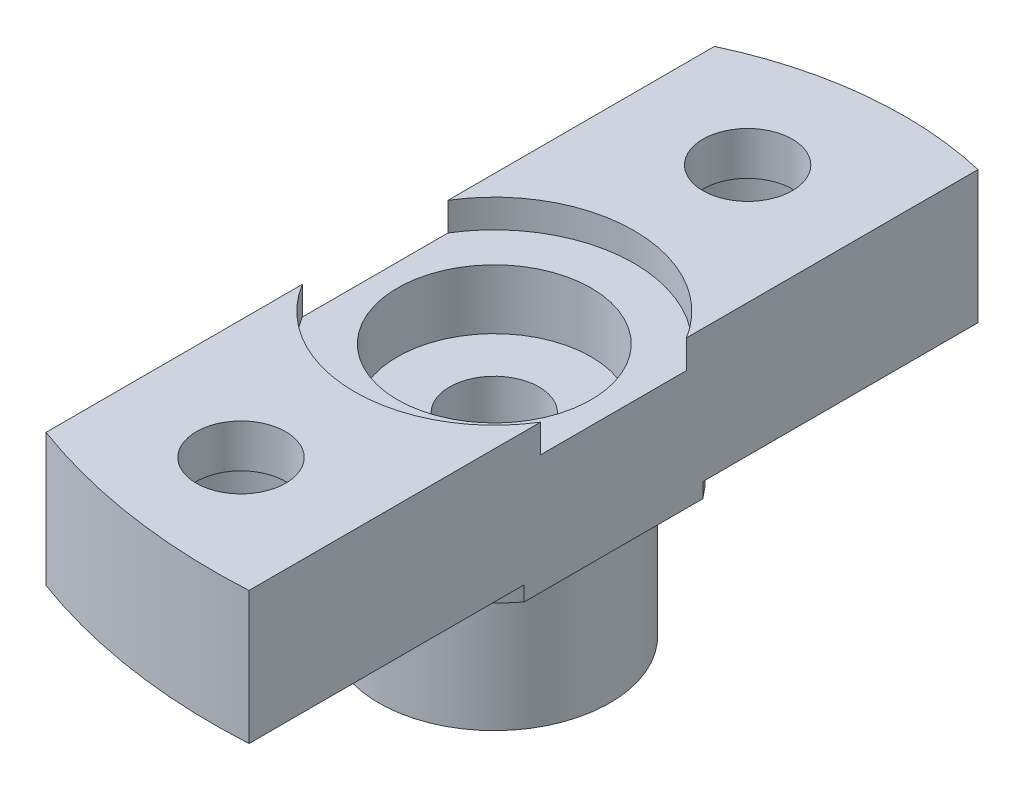
ISO-10303-21;
HEADER;
FILE_DESCRIPTION(('STEP AP214'),'2;1');
FILE_NAME('part.step','',(''),(''),'','','');
FILE_SCHEMA(('AUTOMOTIVE_DESIGN { 1 0 10303 214 1 1 1 1 }'));
ENDSEC;
DATA;
#1=APPLICATION_CONTEXT('core data for automotive mechanical design processes');
#2=APPLICATION_PROTOCOL_DEFINITION('international standard','automotive_design',2000,#1);
#3=PRODUCT_CONTEXT('',#1,'mechanical');
#4=PRODUCT('Part','Part','',(#3));
#5=PRODUCT_RELATED_PRODUCT_CATEGORY('part','',(#4));
#6=PRODUCT_DEFINITION_FORMATION('','',#4);
#7=PRODUCT_DEFINITION_CONTEXT('part definition',#1,'design');
#8=PRODUCT_DEFINITION('design','',#6,#7);
#9=PRODUCT_DEFINITION_SHAPE('','',#8);
#10=(LENGTH_UNIT() NAMED_UNIT(*) SI_UNIT(.MILLI.,.METRE.));
#11=(NAMED_UNIT(*) PLANE_ANGLE_UNIT() SI_UNIT($,.RADIAN.));
#12=(NAMED_UNIT(*) SI_UNIT($,.STERADIAN.) SOLID_ANGLE_UNIT());
#13=UNCERTAINTY_MEASURE_WITH_UNIT(LENGTH_MEASURE(1.E-05),#10,'distance_accuracy_value','');
#14=(GEOMETRIC_REPRESENTATION_CONTEXT(3) GLOBAL_UNCERTAINTY_ASSIGNED_CONTEXT((#13)) GLOBAL_UNIT_ASSIGNED_CONTEXT((#10,
#11,#12)) REPRESENTATION_CONTEXT('',''));
#15=CARTESIAN_POINT('',(0.,0.,0.));
#16=DIRECTION('',(0.,0.,1.));
#17=DIRECTION('',(1.,0.,0.));
#18=AXIS2_PLACEMENT_3D('',#15,#16,#17);
#19=CARTESIAN_POINT('',(0.,-4.66973318295596,0.));
#20=DIRECTION('',(0.,1.,0.));
#21=DIRECTION('',(0.,0.,1.));
#22=AXIS2_PLACEMENT_3D('',#19,#20,#21);
#23=CYLINDRICAL_SURFACE('',#22,1.651);
#24=CARTESIAN_POINT('',(0.,1.778,0.));
#25=DIRECTION('',(0.,1.,0.));
#26=DIRECTION('',(0.,0.,1.));
#27=AXIS2_PLACEMENT_3D('',#24,#25,#26);
#28=CIRCLE('',#27,1.651);
#29=CARTESIAN_POINT('',(0.,1.778,1.651));
#30=VERTEX_POINT('',#29);
#31=EDGE_CURVE('E215',#30,#30,#28,.T.);
#32=ORIENTED_EDGE('',*,*,#31,.T.);
#33=EDGE_LOOP('',(#32));
#34=FACE_BOUND('',#33,.T.);
#35=CARTESIAN_POINT('',(0.,0.762,0.));
#36=DIRECTION('',(0.,-1.,0.));
#37=DIRECTION('',(0.,0.,-1.));
#38=AXIS2_PLACEMENT_3D('',#35,#36,#37);
#39=CIRCLE('',#38,1.651);
#40=CARTESIAN_POINT('',(0.,0.762,-1.651));
#41=VERTEX_POINT('',#40);
#42=EDGE_CURVE('E11',#41,#41,#39,.F.);
#43=ORIENTED_EDGE('',*,*,#42,.F.);
#44=EDGE_LOOP('',(#43));
#45=FACE_BOUND('',#44,.T.);
#46=ADVANCED_FACE('F35',(#34,#45),#23,.F.);
#47=CARTESIAN_POINT('',(0.,0.,0.));
#48=DIRECTION('',(0.,1.,0.));
#49=DIRECTION('',(0.,0.,1.));
#50=AXIS2_PLACEMENT_3D('',#47,#48,#49);
#51=PLANE('',#50);
#52=DIRECTION('',(0.,0.,1.));
#53=VECTOR('',#52,1.);
#54=CARTESIAN_POINT('',(-2.032,0.,0.));
#55=LINE('',#54,#53);
#56=CARTESIAN_POINT('',(-2.032,0.,-5.78492675885656));
#57=VERTEX_POINT('',#56);
#58=CARTESIAN_POINT('',(-2.032,0.,-1.524));
#59=VERTEX_POINT('',#58);
#60=EDGE_CURVE('E249',#57,#59,#55,.T.);
#61=ORIENTED_EDGE('',*,*,#60,.F.);
#62=CARTESIAN_POINT('',(0.614973359977834,0.,-0.158832417744387));
#63=DIRECTION('',(0.,1.,0.));
#64=DIRECTION('',(0.,0.,1.));
#65=AXIS2_PLACEMENT_3D('',#62,#63,#64);
#66=CIRCLE('',#65,6.21766881584463);
#67=CARTESIAN_POINT('',(2.032,0.,-6.21287577776372));
#68=VERTEX_POINT('',#67);
#69=EDGE_CURVE('E174',#68,#57,#66,.T.);
#70=ORIENTED_EDGE('',*,*,#69,.F.);
#71=DIRECTION('',(0.,0.,1.));
#72=VECTOR('',#71,1.);
#73=CARTESIAN_POINT('',(2.032,0.,0.));
#74=LINE('',#73,#72);
#75=CARTESIAN_POINT('',(2.032,0.,-1.524));
#76=VERTEX_POINT('',#75);
#77=EDGE_CURVE('E246',#68,#76,#74,.T.);
#78=ORIENTED_EDGE('',*,*,#77,.T.);
#79=CARTESIAN_POINT('',(0.,0.,0.));
#80=DIRECTION('',(0.,-1.,0.));
#81=DIRECTION('',(0.,0.,-1.));
#82=AXIS2_PLACEMENT_3D('',#79,#80,#81);
#83=CIRCLE('',#82,2.54);
#84=EDGE_CURVE('E194',#59,#76,#83,.T.);
#85=ORIENTED_EDGE('',*,*,#84,.F.);
#86=EDGE_LOOP('',(#61,#70,#78,#85));
#87=FACE_BOUND('',#86,.T.);
#88=CARTESIAN_POINT('',(0.,0.,-4.318));
#89=DIRECTION('',(0.,1.,0.));
#90=DIRECTION('',(0.,0.,1.));
#91=AXIS2_PLACEMENT_3D('',#88,#89,#90);
#92=CIRCLE('',#91,1.27);
#93=CARTESIAN_POINT('',(0.,0.,-5.588));
#94=VERTEX_POINT('',#93);
#95=EDGE_CURVE('E225',#94,#94,#92,.T.);
#96=ORIENTED_EDGE('',*,*,#95,.T.);
#97=EDGE_LOOP('',(#96));
#98=FACE_BOUND('',#97,.T.);
#99=ADVANCED_FACE('F276',(#87,#98),#51,.F.);
#100=CARTESIAN_POINT('',(2.032,2.032,0.));
#101=DIRECTION('',(1.,0.,0.));
#102=DIRECTION('',(0.,0.,-1.));
#103=AXIS2_PLACEMENT_3D('',#100,#101,#102);
#104=PLANE('',#103);
#105=DIRECTION('',(0.,1.,0.));
#106=VECTOR('',#105,1.);
#107=CARTESIAN_POINT('',(2.032,1.778,1.24150213954709));
#108=LINE('',#107,#106);
#109=CARTESIAN_POINT('',(2.032,1.778,1.24150213954709));
#110=VERTEX_POINT('',#109);
#111=CARTESIAN_POINT('',(2.032,2.2606,1.24150213954709));
#112=VERTEX_POINT('',#111);
#113=EDGE_CURVE('E223',#110,#112,#108,.T.);
#114=ORIENTED_EDGE('',*,*,#113,.T.);
#115=DIRECTION('',(0.,0.,-1.));
#116=VECTOR('',#115,1.);
#117=CARTESIAN_POINT('',(2.032,2.2606,0.));
#118=LINE('',#117,#116);
#119=CARTESIAN_POINT('',(2.032,2.2606,6.21287577776395));
#120=VERTEX_POINT('',#119);
#121=EDGE_CURVE('E168',#120,#112,#118,.T.);
#122=ORIENTED_EDGE('',*,*,#121,.F.);
#123=DIRECTION('',(0.,-1.,0.));
#124=VECTOR('',#123,1.);
#125=CARTESIAN_POINT('',(2.032,2.032,6.21287577776395));
#126=LINE('',#125,#124);
#127=CARTESIAN_POINT('',(2.032,0.,6.21287577776395));
#128=VERTEX_POINT('',#127);
#129=EDGE_CURVE('E43',#120,#128,#126,.T.);
#130=ORIENTED_EDGE('',*,*,#129,.T.);
#131=CARTESIAN_POINT('',(2.032,0.,1.524));
#132=VERTEX_POINT('',#131);
#133=EDGE_CURVE('E235',#132,#128,#74,.T.);
#134=ORIENTED_EDGE('',*,*,#133,.F.);
#135=DIRECTION('',(0.,1.,0.));
#136=VECTOR('',#135,1.);
#137=CARTESIAN_POINT('',(2.032,-0.254,1.524));
#138=LINE('',#137,#136);
#139=CARTESIAN_POINT('',(2.032,-0.254,1.524));
#140=VERTEX_POINT('',#139);
#141=EDGE_CURVE('E212',#140,#132,#138,.T.);
#142=ORIENTED_EDGE('',*,*,#141,.F.);
#143=DIRECTION('',(0.,0.,1.));
#144=VECTOR('',#143,1.);
#145=CARTESIAN_POINT('',(2.032,-0.254,0.));
#146=LINE('',#145,#144);
#147=CARTESIAN_POINT('',(2.032,-0.254,-1.524));
#148=VERTEX_POINT('',#147);
#149=EDGE_CURVE('E193',#148,#140,#146,.T.);
#150=ORIENTED_EDGE('',*,*,#149,.F.);
#151=DIRECTION('',(0.,1.,0.));
#152=VECTOR('',#151,1.);
#153=CARTESIAN_POINT('',(2.032,-0.254,-1.524));
#154=LINE('',#153,#152);
#155=EDGE_CURVE('E203',#148,#76,#154,.T.);
#156=ORIENTED_EDGE('',*,*,#155,.T.);
#157=ORIENTED_EDGE('',*,*,#77,.F.);
#158=DIRECTION('',(0.,-1.,0.));
#159=VECTOR('',#158,1.);
#160=CARTESIAN_POINT('',(2.032,2.032,-6.21287577776372));
#161=LINE('',#160,#159);
#162=CARTESIAN_POINT('',(2.032,2.2606,-6.21287577776372));
#163=VERTEX_POINT('',#162);
#164=EDGE_CURVE('E251',#163,#68,#161,.T.);
#165=ORIENTED_EDGE('',*,*,#164,.F.);
#166=DIRECTION('',(0.,0.,-1.));
#167=VECTOR('',#166,1.);
#168=CARTESIAN_POINT('',(2.032,2.2606,0.));
#169=LINE('',#168,#167);
#170=CARTESIAN_POINT('',(2.032,2.2606,-1.24150213954709));
#171=VERTEX_POINT('',#170);
#172=EDGE_CURVE('E147',#171,#163,#169,.T.);
#173=ORIENTED_EDGE('',*,*,#172,.F.);
#174=DIRECTION('',(0.,1.,0.));
#175=VECTOR('',#174,1.);
#176=CARTESIAN_POINT('',(2.032,1.778,-1.24150213954709));
#177=LINE('',#176,#175);
#178=CARTESIAN_POINT('',(2.032,1.778,-1.24150213954709));
#179=VERTEX_POINT('',#178);
#180=EDGE_CURVE('E138',#179,#171,#177,.T.);
#181=ORIENTED_EDGE('',*,*,#180,.F.);
#182=DIRECTION('',(0.,0.,-1.));
#183=VECTOR('',#182,1.);
#184=CARTESIAN_POINT('',(2.032,1.778,0.));
#185=LINE('',#184,#183);
#186=EDGE_CURVE('E216',#110,#179,#185,.T.);
#187=ORIENTED_EDGE('',*,*,#186,.F.);
#188=EDGE_LOOP('',(#114,#122,#130,#134,#142,#150,#156,#157,#165,#173,#181,#187));
#189=FACE_BOUND('',#188,.T.);
#190=ADVANCED_FACE('F37',(#189),#104,.T.);
#191=CARTESIAN_POINT('',(0.,2.032,4.318));
#192=DIRECTION('',(0.,-1.,0.));
#193=DIRECTION('',(0.,0.,-1.));
#194=AXIS2_PLACEMENT_3D('',#191,#192,#193);
#195=CYLINDRICAL_SURFACE('',#194,0.761999999999999);
#196=CARTESIAN_POINT('',(0.,1.524,4.318));
#197=DIRECTION('',(0.,1.,0.));
#198=DIRECTION('',(0.,0.,1.));
#199=AXIS2_PLACEMENT_3D('',#196,#197,#198);
#200=CIRCLE('',#199,0.761999999999999);
#201=CARTESIAN_POINT('',(0.,1.524,5.08));
#202=VERTEX_POINT('',#201);
#203=EDGE_CURVE('E228',#202,#202,#200,.T.);
#204=ORIENTED_EDGE('',*,*,#203,.F.);
#205=EDGE_LOOP('',(#204));
#206=FACE_BOUND('',#205,.T.);
#207=CARTESIAN_POINT('',(0.,2.2606,4.318));
#208=DIRECTION('',(0.,1.,0.));
#209=DIRECTION('',(0.,0.,1.));
#210=AXIS2_PLACEMENT_3D('',#207,#208,#209);
#211=CIRCLE('',#210,0.761999999999999);
#212=CARTESIAN_POINT('',(0.,2.2606,5.08));
#213=VERTEX_POINT('',#212);
#214=EDGE_CURVE('E159',#213,#213,#211,.F.);
#215=ORIENTED_EDGE('',*,*,#214,.F.);
#216=EDGE_LOOP('',(#215));
#217=FACE_BOUND('',#216,.T.);
#218=ADVANCED_FACE('F360',(#206,#217),#195,.F.);
#219=CARTESIAN_POINT('',(-2.032,2.032,0.));
#220=DIRECTION('',(1.,0.,0.));
#221=DIRECTION('',(0.,0.,-1.));
#222=AXIS2_PLACEMENT_3D('',#219,#220,#221);
#223=PLANE('',#222);
#224=CARTESIAN_POINT('',(-2.032,0.,1.524));
#225=VERTEX_POINT('',#224);
#226=CARTESIAN_POINT('',(-2.032,0.,5.60944929125373));
#227=VERTEX_POINT('',#226);
#228=EDGE_CURVE('E248',#225,#227,#55,.T.);
#229=ORIENTED_EDGE('',*,*,#228,.T.);
#230=DIRECTION('',(0.,-1.,0.));
#231=VECTOR('',#230,1.);
#232=CARTESIAN_POINT('',(-2.032,6.87219500334325,5.60944929125373));
#233=LINE('',#232,#231);
#234=CARTESIAN_POINT('',(-2.032,2.2606,5.60944929125373));
#235=VERTEX_POINT('',#234);
#236=EDGE_CURVE('E50',#235,#227,#233,.T.);
#237=ORIENTED_EDGE('',*,*,#236,.F.);
#238=DIRECTION('',(0.,0.,1.));
#239=VECTOR('',#238,1.);
#240=CARTESIAN_POINT('',(-2.032,2.2606,0.));
#241=LINE('',#240,#239);
#242=CARTESIAN_POINT('',(-2.032,2.2606,1.24150213954709));
#243=VERTEX_POINT('',#242);
#244=EDGE_CURVE('E162',#243,#235,#241,.T.);
#245=ORIENTED_EDGE('',*,*,#244,.F.);
#246=DIRECTION('',(0.,1.,0.));
#247=VECTOR('',#246,1.);
#248=CARTESIAN_POINT('',(-2.032,1.778,1.24150213954709));
#249=LINE('',#248,#247);
#250=CARTESIAN_POINT('',(-2.032,1.778,1.24150213954709));
#251=VERTEX_POINT('',#250);
#252=EDGE_CURVE('E137',#251,#243,#249,.T.);
#253=ORIENTED_EDGE('',*,*,#252,.F.);
#254=DIRECTION('',(0.,0.,1.));
#255=VECTOR('',#254,1.);
#256=CARTESIAN_POINT('',(-2.032,1.778,0.));
#257=LINE('',#256,#255);
#258=CARTESIAN_POINT('',(-2.032,1.778,-1.24150213954709));
#259=VERTEX_POINT('',#258);
#260=EDGE_CURVE('E134',#259,#251,#257,.T.);
#261=ORIENTED_EDGE('',*,*,#260,.F.);
#262=DIRECTION('',(0.,1.,0.));
#263=VECTOR('',#262,1.);
#264=CARTESIAN_POINT('',(-2.032,1.778,-1.24150213954709));
#265=LINE('',#264,#263);
#266=CARTESIAN_POINT('',(-2.032,2.2606,-1.24150213954709));
#267=VERTEX_POINT('',#266);
#268=EDGE_CURVE('E125',#259,#267,#265,.T.);
#269=ORIENTED_EDGE('',*,*,#268,.T.);
#270=DIRECTION('',(0.,0.,-1.));
#271=VECTOR('',#270,1.);
#272=CARTESIAN_POINT('',(-2.032,2.2606,0.));
#273=LINE('',#272,#271);
#274=CARTESIAN_POINT('',(-2.032,2.2606,-5.78492675885656));
#275=VERTEX_POINT('',#274);
#276=EDGE_CURVE('E131',#267,#275,#273,.T.);
#277=ORIENTED_EDGE('',*,*,#276,.T.);
#278=DIRECTION('',(0.,-1.,0.));
#279=VECTOR('',#278,1.);
#280=CARTESIAN_POINT('',(-2.032,6.87219500334325,-5.78492675885656));
#281=LINE('',#280,#279);
#282=EDGE_CURVE('E177',#275,#57,#281,.T.);
#283=ORIENTED_EDGE('',*,*,#282,.T.);
#284=ORIENTED_EDGE('',*,*,#60,.T.);
#285=DIRECTION('',(0.,1.,0.));
#286=VECTOR('',#285,1.);
#287=CARTESIAN_POINT('',(-2.032,-0.254,-1.524));
#288=LINE('',#287,#286);
#289=CARTESIAN_POINT('',(-2.032,-0.254,-1.524));
#290=VERTEX_POINT('',#289);
#291=EDGE_CURVE('E206',#290,#59,#288,.T.);
#292=ORIENTED_EDGE('',*,*,#291,.F.);
#293=DIRECTION('',(0.,0.,-1.));
#294=VECTOR('',#293,1.);
#295=CARTESIAN_POINT('',(-2.032,-0.254,0.));
#296=LINE('',#295,#294);
#297=CARTESIAN_POINT('',(-2.032,-0.254,1.524));
#298=VERTEX_POINT('',#297);
#299=EDGE_CURVE('E199',#298,#290,#296,.T.);
#300=ORIENTED_EDGE('',*,*,#299,.F.);
#301=DIRECTION('',(0.,1.,0.));
#302=VECTOR('',#301,1.);
#303=CARTESIAN_POINT('',(-2.032,-0.254,1.524));
#304=LINE('',#303,#302);
#305=EDGE_CURVE('E209',#298,#225,#304,.T.);
#306=ORIENTED_EDGE('',*,*,#305,.T.);
#307=EDGE_LOOP('',(#229,#237,#245,#253,#261,#269,#277,#283,#284,#292,#300,#306));
#308=FACE_BOUND('',#307,.T.);
#309=ADVANCED_FACE('F128',(#308),#223,.F.);
#310=CARTESIAN_POINT('',(0.,2.032,-4.318));
#311=DIRECTION('',(0.,-1.,0.));
#312=DIRECTION('',(0.,0.,-1.));
#313=AXIS2_PLACEMENT_3D('',#310,#311,#312);
#314=CYLINDRICAL_SURFACE('',#313,0.761999999999999);
#315=CARTESIAN_POINT('',(0.,1.524,-4.318));
#316=DIRECTION('',(0.,1.,0.));
#317=DIRECTION('',(0.,0.,1.));
#318=AXIS2_PLACEMENT_3D('',#315,#316,#317);
#319=CIRCLE('',#318,0.761999999999999);
#320=CARTESIAN_POINT('',(0.,1.524,-3.556));
#321=VERTEX_POINT('',#320);
#322=EDGE_CURVE('E239',#321,#321,#319,.T.);
#323=ORIENTED_EDGE('',*,*,#322,.F.);
#324=EDGE_LOOP('',(#323));
#325=FACE_BOUND('',#324,.T.);
#326=CARTESIAN_POINT('',(4.96130914129367E-13,2.2606,-4.31800000000037));
#327=DIRECTION('',(0.,1.,0.));
#328=DIRECTION('',(0.,0.,1.));
#329=AXIS2_PLACEMENT_3D('',#326,#327,#328);
#330=CIRCLE('',#329,0.761999999999423);
#331=CARTESIAN_POINT('',(4.96130914129367E-13,2.2606,-3.55600000000095));
#332=VERTEX_POINT('',#331);
#333=EDGE_CURVE('E152',#332,#332,#330,.T.);
#334=ORIENTED_EDGE('',*,*,#333,.T.);
#335=EDGE_LOOP('',(#334));
#336=FACE_BOUND('',#335,.T.);
#337=ADVANCED_FACE('F351',(#325,#336),#314,.F.);
#338=ORIENTED_EDGE('',*,*,#133,.T.);
#339=CARTESIAN_POINT('',(1.4403671293449,0.,-3.78952536122972));
#340=DIRECTION('',(0.,1.,0.));
#341=DIRECTION('',(0.,0.,-1.));
#342=AXIS2_PLACEMENT_3D('',#339,#340,#341);
#343=CIRCLE('',#342,10.0198831330002);
#344=EDGE_CURVE('E175',#227,#128,#343,.T.);
#345=ORIENTED_EDGE('',*,*,#344,.F.);
#346=ORIENTED_EDGE('',*,*,#228,.F.);
#347=EDGE_CURVE('E58',#132,#225,#83,.T.);
#348=ORIENTED_EDGE('',*,*,#347,.F.);
#349=EDGE_LOOP('',(#338,#345,#346,#348));
#350=FACE_BOUND('',#349,.T.);
#351=CARTESIAN_POINT('',(0.,0.,4.318));
#352=DIRECTION('',(0.,1.,0.));
#353=DIRECTION('',(0.,0.,1.));
#354=AXIS2_PLACEMENT_3D('',#351,#352,#353);
#355=CIRCLE('',#354,1.27);
#356=CARTESIAN_POINT('',(0.,0.,3.048));
#357=VERTEX_POINT('',#356);
#358=EDGE_CURVE('E232',#357,#357,#355,.T.);
#359=ORIENTED_EDGE('',*,*,#358,.T.);
#360=EDGE_LOOP('',(#359));
#361=FACE_BOUND('',#360,.T.);
#362=ADVANCED_FACE('F291',(#350,#361),#51,.F.);
#363=CARTESIAN_POINT('',(0.,1.524,-4.318));
#364=DIRECTION('',(0.,-1.,0.));
#365=DIRECTION('',(0.,0.,-1.));
#366=AXIS2_PLACEMENT_3D('',#363,#364,#365);
#367=CYLINDRICAL_SURFACE('',#366,1.27);
#368=CARTESIAN_POINT('',(0.,1.524,-4.318));
#369=DIRECTION('',(0.,1.,0.));
#370=DIRECTION('',(0.,0.,1.));
#371=AXIS2_PLACEMENT_3D('',#368,#369,#370);
#372=CIRCLE('',#371,1.27);
#373=CARTESIAN_POINT('',(0.,1.524,-5.588));
#374=VERTEX_POINT('',#373);
#375=EDGE_CURVE('E238',#374,#374,#372,.T.);
#376=CARTESIAN_POINT('',(0.,1.524,-5.588));
#377=CARTESIAN_POINT('',(0.,1.508125,-5.588));
#378=CARTESIAN_POINT('',(0.,1.49225,-5.588));
#379=CARTESIAN_POINT('',(0.,1.4605,-5.588));
#380=CARTESIAN_POINT('',(0.,1.444625,-5.588));
#381=CARTESIAN_POINT('',(0.,1.412875,-5.588));
#382=CARTESIAN_POINT('',(0.,1.397,-5.588));
#383=CARTESIAN_POINT('',(0.,1.36525,-5.588));
#384=CARTESIAN_POINT('',(0.,1.349375,-5.588));
#385=CARTESIAN_POINT('',(0.,1.317625,-5.588));
#386=CARTESIAN_POINT('',(0.,1.30175,-5.588));
#387=CARTESIAN_POINT('',(0.,1.27,-5.588));
#388=CARTESIAN_POINT('',(0.,1.254125,-5.588));
#389=CARTESIAN_POINT('',(0.,1.222375,-5.588));
#390=CARTESIAN_POINT('',(0.,1.2065,-5.588));
#391=CARTESIAN_POINT('',(0.,1.17475,-5.588));
#392=CARTESIAN_POINT('',(0.,1.158875,-5.588));
#393=CARTESIAN_POINT('',(0.,1.127125,-5.588));
#394=CARTESIAN_POINT('',(0.,1.11125,-5.588));
#395=CARTESIAN_POINT('',(0.,1.0795,-5.588));
#396=CARTESIAN_POINT('',(0.,1.063625,-5.588));
#397=CARTESIAN_POINT('',(0.,1.031875,-5.588));
#398=CARTESIAN_POINT('',(0.,1.016,-5.588));
#399=CARTESIAN_POINT('',(0.,0.98425,-5.588));
#400=CARTESIAN_POINT('',(0.,0.968375,-5.588));
#401=CARTESIAN_POINT('',(0.,0.936625,-5.588));
#402=CARTESIAN_POINT('',(0.,0.92075,-5.588));
#403=CARTESIAN_POINT('',(0.,0.889,-5.588));
#404=CARTESIAN_POINT('',(0.,0.873125,-5.588));
#405=CARTESIAN_POINT('',(0.,0.841375,-5.588));
#406=CARTESIAN_POINT('',(0.,0.8255,-5.588));
#407=CARTESIAN_POINT('',(0.,0.79375,-5.588));
#408=CARTESIAN_POINT('',(0.,0.777875,-5.588));
#409=CARTESIAN_POINT('',(0.,0.746125,-5.588));
#410=CARTESIAN_POINT('',(0.,0.73025,-5.588));
#411=CARTESIAN_POINT('',(0.,0.6985,-5.588));
#412=CARTESIAN_POINT('',(0.,0.682625,-5.588));
#413=CARTESIAN_POINT('',(0.,0.650875,-5.588));
#414=CARTESIAN_POINT('',(0.,0.635,-5.588));
#415=CARTESIAN_POINT('',(0.,0.60325,-5.588));
#416=CARTESIAN_POINT('',(0.,0.587375,-5.588));
#417=CARTESIAN_POINT('',(0.,0.555625,-5.588));
#418=CARTESIAN_POINT('',(0.,0.53975,-5.588));
#419=CARTESIAN_POINT('',(0.,0.508,-5.588));
#420=CARTESIAN_POINT('',(0.,0.492125,-5.588));
#421=CARTESIAN_POINT('',(0.,0.460375,-5.588));
#422=CARTESIAN_POINT('',(0.,0.4445,-5.588));
#423=CARTESIAN_POINT('',(0.,0.41275,-5.588));
#424=CARTESIAN_POINT('',(0.,0.396875,-5.588));
#425=CARTESIAN_POINT('',(0.,0.365125,-5.588));
#426=CARTESIAN_POINT('',(0.,0.34925,-5.588));
#427=CARTESIAN_POINT('',(0.,0.3175,-5.588));
#428=CARTESIAN_POINT('',(0.,0.301625,-5.588));
#429=CARTESIAN_POINT('',(0.,0.269875,-5.588));
#430=CARTESIAN_POINT('',(0.,0.254,-5.588));
#431=CARTESIAN_POINT('',(0.,0.22225,-5.588));
#432=CARTESIAN_POINT('',(0.,0.206375,-5.588));
#433=CARTESIAN_POINT('',(0.,0.174625,-5.588));
#434=CARTESIAN_POINT('',(0.,0.15875,-5.588));
#435=CARTESIAN_POINT('',(0.,0.127,-5.588));
#436=CARTESIAN_POINT('',(0.,0.111125,-5.588));
#437=CARTESIAN_POINT('',(0.,0.079375,-5.588));
#438=CARTESIAN_POINT('',(0.,0.0635,-5.588));
#439=CARTESIAN_POINT('',(0.,0.0317499999999999,-5.588));
#440=CARTESIAN_POINT('',(0.,0.015875,-5.588));
#441=CARTESIAN_POINT('',(0.,0.,-5.588));
#442=B_SPLINE_CURVE_WITH_KNOTS('',3,(#376,#377,#378,#379,#380,#381,#382,#383,#384,#385,#386,
#387,#388,#389,#390,#391,#392,#393,#394,#395,#396,#397,#398,#399,#400,#401,#402,#403,#404,#405,
#406,#407,#408,#409,#410,#411,#412,#413,#414,#415,#416,#417,#418,#419,#420,#421,#422,#423,#424,
#425,#426,#427,#428,#429,#430,#431,#432,#433,#434,#435,#436,#437,#438,#439,#440,#441),
.UNSPECIFIED.,.F.,.F.,(4,2,2,2,2,2,2,2,2,2,2,2,2,2,2,2,2,2,2,2,2,2,2,2,2,2,2,2,2,2,2,2,4),(0.,
0.0476249999999999,0.0952499999999998,0.142875,0.1905,0.238125,0.28575,0.333375,0.381,0.428625,
0.47625,0.523875,0.5715,0.619125,0.66675,0.714375,0.762,0.809625,0.85725,0.904875,0.9525,
1.000125,1.04775,1.095375,1.143,1.190625,1.23825,1.285875,1.3335,1.381125,1.42875,1.476375,
1.524),.UNSPECIFIED.);
#443=EDGE_CURVE('BSEAM359',#374,#94,#442,.T.);
#444=ORIENTED_EDGE('',*,*,#375,.T.);
#445=ORIENTED_EDGE('',*,*,#95,.F.);
#446=ORIENTED_EDGE('',*,*,#443,.T.);
#447=ORIENTED_EDGE('',*,*,#443,.F.);
#448=EDGE_LOOP('',(#444,#446,#445,#447));
#449=FACE_BOUND('',#448,.T.);
#450=ADVANCED_FACE('F359',(#449),#367,.F.);
#451=CARTESIAN_POINT('',(0.,1.524,0.));
#452=DIRECTION('',(0.,1.,0.));
#453=DIRECTION('',(0.,0.,1.));
#454=AXIS2_PLACEMENT_3D('',#451,#452,#453);
#455=PLANE('',#454);
#456=ORIENTED_EDGE('',*,*,#322,.T.);
#457=EDGE_LOOP('',(#456));
#458=FACE_BOUND('',#457,.T.);
#459=ORIENTED_EDGE('',*,*,#375,.F.);
#460=EDGE_LOOP('',(#459));
#461=FACE_BOUND('',#460,.T.);
#462=ADVANCED_FACE('F377',(#458,#461),#455,.F.);
#463=CARTESIAN_POINT('',(0.,1.524,4.318));
#464=DIRECTION('',(0.,-1.,0.));
#465=DIRECTION('',(0.,0.,-1.));
#466=AXIS2_PLACEMENT_3D('',#463,#464,#465);
#467=CYLINDRICAL_SURFACE('',#466,1.27);
#468=CARTESIAN_POINT('',(0.,1.524,4.318));
#469=DIRECTION('',(0.,1.,0.));
#470=DIRECTION('',(0.,0.,1.));
#471=AXIS2_PLACEMENT_3D('',#468,#469,#470);
#472=CIRCLE('',#471,1.27);
#473=CARTESIAN_POINT('',(0.,1.524,3.048));
#474=VERTEX_POINT('',#473);
#475=EDGE_CURVE('E231',#474,#474,#472,.T.);
#476=CARTESIAN_POINT('',(0.,1.524,3.048));
#477=CARTESIAN_POINT('',(0.,1.508125,3.048));
#478=CARTESIAN_POINT('',(0.,1.49225,3.048));
#479=CARTESIAN_POINT('',(0.,1.4605,3.048));
#480=CARTESIAN_POINT('',(0.,1.444625,3.048));
#481=CARTESIAN_POINT('',(0.,1.412875,3.048));
#482=CARTESIAN_POINT('',(0.,1.397,3.048));
#483=CARTESIAN_POINT('',(0.,1.36525,3.048));
#484=CARTESIAN_POINT('',(0.,1.349375,3.048));
#485=CARTESIAN_POINT('',(0.,1.317625,3.048));
#486=CARTESIAN_POINT('',(0.,1.30175,3.048));
#487=CARTESIAN_POINT('',(0.,1.27,3.048));
#488=CARTESIAN_POINT('',(0.,1.254125,3.048));
#489=CARTESIAN_POINT('',(0.,1.222375,3.048));
#490=CARTESIAN_POINT('',(0.,1.2065,3.048));
#491=CARTESIAN_POINT('',(0.,1.17475,3.048));
#492=CARTESIAN_POINT('',(0.,1.158875,3.048));
#493=CARTESIAN_POINT('',(0.,1.127125,3.048));
#494=CARTESIAN_POINT('',(0.,1.11125,3.048));
#495=CARTESIAN_POINT('',(0.,1.0795,3.048));
#496=CARTESIAN_POINT('',(0.,1.063625,3.048));
#497=CARTESIAN_POINT('',(0.,1.031875,3.048));
#498=CARTESIAN_POINT('',(0.,1.016,3.048));
#499=CARTESIAN_POINT('',(0.,0.98425,3.048));
#500=CARTESIAN_POINT('',(0.,0.968375,3.048));
#501=CARTESIAN_POINT('',(0.,0.936625,3.048));
#502=CARTESIAN_POINT('',(0.,0.92075,3.048));
#503=CARTESIAN_POINT('',(0.,0.889,3.048));
#504=CARTESIAN_POINT('',(0.,0.873125,3.048));
#505=CARTESIAN_POINT('',(0.,0.841375,3.048));
#506=CARTESIAN_POINT('',(0.,0.8255,3.048));
#507=CARTESIAN_POINT('',(0.,0.79375,3.048));
#508=CARTESIAN_POINT('',(0.,0.777875,3.048));
#509=CARTESIAN_POINT('',(0.,0.746125,3.048));
#510=CARTESIAN_POINT('',(0.,0.73025,3.048));
#511=CARTESIAN_POINT('',(0.,0.6985,3.048));
#512=CARTESIAN_POINT('',(0.,0.682625,3.048));
#513=CARTESIAN_POINT('',(0.,0.650875,3.048));
#514=CARTESIAN_POINT('',(0.,0.635,3.048));
#515=CARTESIAN_POINT('',(0.,0.60325,3.048));
#516=CARTESIAN_POINT('',(0.,0.587375,3.048));
#517=CARTESIAN_POINT('',(0.,0.555625,3.048));
#518=CARTESIAN_POINT('',(0.,0.53975,3.048));
#519=CARTESIAN_POINT('',(0.,0.508,3.048));
#520=CARTESIAN_POINT('',(0.,0.492125,3.048));
#521=CARTESIAN_POINT('',(0.,0.460375,3.048));
#522=CARTESIAN_POINT('',(0.,0.4445,3.048));
#523=CARTESIAN_POINT('',(0.,0.41275,3.048));
#524=CARTESIAN_POINT('',(0.,0.396875,3.048));
#525=CARTESIAN_POINT('',(0.,0.365125,3.048));
#526=CARTESIAN_POINT('',(0.,0.34925,3.048));
#527=CARTESIAN_POINT('',(0.,0.3175,3.048));
#528=CARTESIAN_POINT('',(0.,0.301625,3.048));
#529=CARTESIAN_POINT('',(0.,0.269875,3.048));
#530=CARTESIAN_POINT('',(0.,0.254,3.048));
#531=CARTESIAN_POINT('',(0.,0.22225,3.048));
#532=CARTESIAN_POINT('',(0.,0.206375,3.048));
#533=CARTESIAN_POINT('',(0.,0.174625,3.048));
#534=CARTESIAN_POINT('',(0.,0.15875,3.048));
#535=CARTESIAN_POINT('',(0.,0.127,3.048));
#536=CARTESIAN_POINT('',(0.,0.111125,3.048));
#537=CARTESIAN_POINT('',(0.,0.079375,3.048));
#538=CARTESIAN_POINT('',(0.,0.0635,3.048));
#539=CARTESIAN_POINT('',(0.,0.0317499999999999,3.048));
#540=CARTESIAN_POINT('',(0.,0.015875,3.048));
#541=CARTESIAN_POINT('',(0.,0.,3.048));
#542=B_SPLINE_CURVE_WITH_KNOTS('',3,(#476,#477,#478,#479,#480,#481,#482,#483,#484,#485,#486,
#487,#488,#489,#490,#491,#492,#493,#494,#495,#496,#497,#498,#499,#500,#501,#502,#503,#504,#505,
#506,#507,#508,#509,#510,#511,#512,#513,#514,#515,#516,#517,#518,#519,#520,#521,#522,#523,#524,
#525,#526,#527,#528,#529,#530,#531,#532,#533,#534,#535,#536,#537,#538,#539,#540,#541),
.UNSPECIFIED.,.F.,.F.,(4,2,2,2,2,2,2,2,2,2,2,2,2,2,2,2,2,2,2,2,2,2,2,2,2,2,2,2,2,2,2,2,4),(0.,
0.0476249999999999,0.0952499999999998,0.142875,0.1905,0.238125,0.28575,0.333375,0.381,0.428625,
0.47625,0.523875,0.5715,0.619125,0.66675,0.714375,0.762,0.809625,0.85725,0.904875,0.9525,
1.000125,1.04775,1.095375,1.143,1.190625,1.23825,1.285875,1.3335,1.381125,1.42875,1.476375,
1.524),.UNSPECIFIED.);
#543=EDGE_CURVE('BSEAM307',#474,#357,#542,.T.);
#544=ORIENTED_EDGE('',*,*,#475,.T.);
#545=ORIENTED_EDGE('',*,*,#358,.F.);
#546=ORIENTED_EDGE('',*,*,#543,.T.);
#547=ORIENTED_EDGE('',*,*,#543,.F.);
#548=EDGE_LOOP('',(#544,#546,#545,#547));
#549=FACE_BOUND('',#548,.T.);
#550=ADVANCED_FACE('F307',(#549),#467,.F.);
#551=CARTESIAN_POINT('',(0.,1.524,0.));
#552=DIRECTION('',(0.,1.,0.));
#553=DIRECTION('',(0.,0.,1.));
#554=AXIS2_PLACEMENT_3D('',#551,#552,#553);
#555=PLANE('',#554);
#556=ORIENTED_EDGE('',*,*,#203,.T.);
#557=EDGE_LOOP('',(#556));
#558=FACE_BOUND('',#557,.T.);
#559=ORIENTED_EDGE('',*,*,#475,.F.);
#560=EDGE_LOOP('',(#559));
#561=FACE_BOUND('',#560,.T.);
#562=ADVANCED_FACE('F301',(#558,#561),#555,.F.);
#563=CARTESIAN_POINT('',(0.,1.778,0.));
#564=DIRECTION('',(0.,1.,0.));
#565=DIRECTION('',(0.,0.,1.));
#566=AXIS2_PLACEMENT_3D('',#563,#564,#565);
#567=CYLINDRICAL_SURFACE('',#566,2.38125);
#568=ORIENTED_EDGE('',*,*,#252,.T.);
#569=CARTESIAN_POINT('',(0.,2.2606,0.));
#570=DIRECTION('',(0.,1.,0.));
#571=DIRECTION('',(0.,0.,1.));
#572=AXIS2_PLACEMENT_3D('',#569,#570,#571);
#573=CIRCLE('',#572,2.38125);
#574=EDGE_CURVE('E171',#112,#243,#573,.F.);
#575=ORIENTED_EDGE('',*,*,#574,.F.);
#576=ORIENTED_EDGE('',*,*,#113,.F.);
#577=CARTESIAN_POINT('',(0.,1.778,0.));
#578=DIRECTION('',(0.,1.,0.));
#579=DIRECTION('',(0.,0.,1.));
#580=AXIS2_PLACEMENT_3D('',#577,#578,#579);
#581=CIRCLE('',#580,2.38125);
#582=EDGE_CURVE('E221',#251,#110,#581,.T.);
#583=ORIENTED_EDGE('',*,*,#582,.F.);
#584=EDGE_LOOP('',(#568,#575,#576,#583));
#585=FACE_BOUND('',#584,.T.);
#586=ADVANCED_FACE('F299',(#585),#567,.F.);
#587=ORIENTED_EDGE('',*,*,#180,.T.);
#588=CARTESIAN_POINT('',(0.,2.2606,0.));
#589=DIRECTION('',(0.,1.,0.));
#590=DIRECTION('',(0.,0.,1.));
#591=AXIS2_PLACEMENT_3D('',#588,#589,#590);
#592=CIRCLE('',#591,2.38125000000001);
#593=EDGE_CURVE('E141',#267,#171,#592,.F.);
#594=ORIENTED_EDGE('',*,*,#593,.F.);
#595=ORIENTED_EDGE('',*,*,#268,.F.);
#596=EDGE_CURVE('E219',#179,#259,#581,.T.);
#597=ORIENTED_EDGE('',*,*,#596,.F.);
#598=EDGE_LOOP('',(#587,#594,#595,#597));
#599=FACE_BOUND('',#598,.T.);
#600=ADVANCED_FACE('F142',(#599),#567,.F.);
#601=CARTESIAN_POINT('',(0.,1.778,0.));
#602=DIRECTION('',(0.,1.,0.));
#603=DIRECTION('',(0.,0.,1.));
#604=AXIS2_PLACEMENT_3D('',#601,#602,#603);
#605=PLANE('',#604);
#606=ORIENTED_EDGE('',*,*,#31,.F.);
#607=EDGE_LOOP('',(#606));
#608=FACE_BOUND('',#607,.T.);
#609=ORIENTED_EDGE('',*,*,#186,.T.);
#610=ORIENTED_EDGE('',*,*,#596,.T.);
#611=ORIENTED_EDGE('',*,*,#260,.T.);
#612=ORIENTED_EDGE('',*,*,#582,.T.);
#613=EDGE_LOOP('',(#609,#610,#611,#612));
#614=FACE_BOUND('',#613,.T.);
#615=ADVANCED_FACE('F259',(#608,#614),#605,.T.);
#616=CARTESIAN_POINT('',(0.,-0.254,0.));
#617=DIRECTION('',(0.,1.,0.));
#618=DIRECTION('',(0.,0.,1.));
#619=AXIS2_PLACEMENT_3D('',#616,#617,#618);
#620=CYLINDRICAL_SURFACE('',#619,2.54);
#621=ORIENTED_EDGE('',*,*,#347,.T.);
#622=ORIENTED_EDGE('',*,*,#305,.F.);
#623=CARTESIAN_POINT('',(0.,-0.254,0.));
#624=DIRECTION('',(0.,-1.,0.));
#625=DIRECTION('',(0.,0.,-1.));
#626=AXIS2_PLACEMENT_3D('',#623,#624,#625);
#627=CIRCLE('',#626,2.54);
#628=EDGE_CURVE('E197',#140,#298,#627,.T.);
#629=ORIENTED_EDGE('',*,*,#628,.F.);
#630=ORIENTED_EDGE('',*,*,#141,.T.);
#631=EDGE_LOOP('',(#621,#622,#629,#630));
#632=FACE_BOUND('',#631,.T.);
#633=ADVANCED_FACE('F262',(#632),#620,.T.);
#634=ORIENTED_EDGE('',*,*,#84,.T.);
#635=ORIENTED_EDGE('',*,*,#155,.F.);
#636=EDGE_CURVE('E200',#290,#148,#627,.T.);
#637=ORIENTED_EDGE('',*,*,#636,.F.);
#638=ORIENTED_EDGE('',*,*,#291,.T.);
#639=EDGE_LOOP('',(#634,#635,#637,#638));
#640=FACE_BOUND('',#639,.T.);
#641=ADVANCED_FACE('F282',(#640),#620,.T.);
#642=CARTESIAN_POINT('',(0.,-0.254,0.));
#643=DIRECTION('',(0.,-1.,0.));
#644=DIRECTION('',(0.,0.,-1.));
#645=AXIS2_PLACEMENT_3D('',#642,#643,#644);
#646=PLANE('',#645);
#647=CARTESIAN_POINT('',(0.,-0.254,0.));
#648=DIRECTION('',(0.,-1.,0.));
#649=DIRECTION('',(0.,0.,-1.));
#650=AXIS2_PLACEMENT_3D('',#647,#648,#649);
#651=CIRCLE('',#650,1.9685);
#652=CARTESIAN_POINT('',(0.,-0.254,-1.9685));
#653=VERTEX_POINT('',#652);
#654=EDGE_CURVE('E190',#653,#653,#651,.T.);
#655=ORIENTED_EDGE('',*,*,#654,.F.);
#656=EDGE_LOOP('',(#655));
#657=FACE_BOUND('',#656,.T.);
#658=ORIENTED_EDGE('',*,*,#149,.T.);
#659=ORIENTED_EDGE('',*,*,#628,.T.);
#660=ORIENTED_EDGE('',*,*,#299,.T.);
#661=ORIENTED_EDGE('',*,*,#636,.T.);
#662=EDGE_LOOP('',(#658,#659,#660,#661));
#663=FACE_BOUND('',#662,.T.);
#664=ADVANCED_FACE('F286',(#657,#663),#646,.T.);
#665=CARTESIAN_POINT('',(0.,0.762,0.));
#666=DIRECTION('',(0.,-1.,0.));
#667=DIRECTION('',(0.,0.,-1.));
#668=AXIS2_PLACEMENT_3D('',#665,#666,#667);
#669=PLANE('',#668);
#670=CARTESIAN_POINT('',(0.,0.762,0.));
#671=DIRECTION('',(0.,-1.,0.));
#672=DIRECTION('',(0.,0.,-1.));
#673=AXIS2_PLACEMENT_3D('',#670,#671,#672);
#674=CIRCLE('',#673,0.762);
#675=CARTESIAN_POINT('',(0.,0.762,-0.762));
#676=VERTEX_POINT('',#675);
#677=EDGE_CURVE('E187',#676,#676,#674,.T.);
#678=ORIENTED_EDGE('',*,*,#677,.T.);
#679=EDGE_LOOP('',(#678));
#680=FACE_BOUND('',#679,.T.);
#681=ORIENTED_EDGE('',*,*,#42,.T.);
#682=EDGE_LOOP('',(#681));
#683=FACE_BOUND('',#682,.T.);
#684=ADVANCED_FACE('F321',(#680,#683),#669,.F.);
#685=CARTESIAN_POINT('',(0.,0.762,0.));
#686=DIRECTION('',(0.,-1.,0.));
#687=DIRECTION('',(0.,0.,-1.));
#688=AXIS2_PLACEMENT_3D('',#685,#686,#687);
#689=CYLINDRICAL_SURFACE('',#688,1.9685);
#690=CARTESIAN_POINT('',(0.,-2.54,0.));
#691=DIRECTION('',(0.,-1.,0.));
#692=DIRECTION('',(0.,0.,-1.));
#693=AXIS2_PLACEMENT_3D('',#690,#691,#692);
#694=CIRCLE('',#693,1.9685);
#695=CARTESIAN_POINT('',(0.,-2.54,-1.9685));
#696=VERTEX_POINT('',#695);
#697=EDGE_CURVE('E179',#696,#696,#694,.T.);
#698=CARTESIAN_POINT('',(0.,-0.254,-1.9685));
#699=CARTESIAN_POINT('',(0.,-0.2778125,-1.9685));
#700=CARTESIAN_POINT('',(0.,-0.301625,-1.9685));
#701=CARTESIAN_POINT('',(0.,-0.34925,-1.9685));
#702=CARTESIAN_POINT('',(0.,-0.3730625,-1.9685));
#703=CARTESIAN_POINT('',(0.,-0.4206875,-1.9685));
#704=CARTESIAN_POINT('',(0.,-0.4445,-1.9685));
#705=CARTESIAN_POINT('',(0.,-0.492125,-1.9685));
#706=CARTESIAN_POINT('',(0.,-0.5159375,-1.9685));
#707=CARTESIAN_POINT('',(0.,-0.5635625,-1.9685));
#708=CARTESIAN_POINT('',(0.,-0.587375,-1.9685));
#709=CARTESIAN_POINT('',(0.,-0.635,-1.9685));
#710=CARTESIAN_POINT('',(0.,-0.6588125,-1.9685));
#711=CARTESIAN_POINT('',(0.,-0.7064375,-1.9685));
#712=CARTESIAN_POINT('',(0.,-0.73025,-1.9685));
#713=CARTESIAN_POINT('',(0.,-0.777875,-1.9685));
#714=CARTESIAN_POINT('',(0.,-0.8016875,-1.9685));
#715=CARTESIAN_POINT('',(0.,-0.8493125,-1.9685));
#716=CARTESIAN_POINT('',(0.,-0.873125,-1.9685));
#717=CARTESIAN_POINT('',(0.,-0.92075,-1.9685));
#718=CARTESIAN_POINT('',(0.,-0.9445625,-1.9685));
#719=CARTESIAN_POINT('',(0.,-0.9921875,-1.9685));
#720=CARTESIAN_POINT('',(0.,-1.016,-1.9685));
#721=CARTESIAN_POINT('',(0.,-1.063625,-1.9685));
#722=CARTESIAN_POINT('',(0.,-1.0874375,-1.9685));
#723=CARTESIAN_POINT('',(0.,-1.1350625,-1.9685));
#724=CARTESIAN_POINT('',(0.,-1.158875,-1.9685));
#725=CARTESIAN_POINT('',(0.,-1.2065,-1.9685));
#726=CARTESIAN_POINT('',(0.,-1.2303125,-1.9685));
#727=CARTESIAN_POINT('',(0.,-1.2779375,-1.9685));
#728=CARTESIAN_POINT('',(0.,-1.30175,-1.9685));
#729=CARTESIAN_POINT('',(0.,-1.349375,-1.9685));
#730=CARTESIAN_POINT('',(0.,-1.3731875,-1.9685));
#731=CARTESIAN_POINT('',(0.,-1.4208125,-1.9685));
#732=CARTESIAN_POINT('',(0.,-1.444625,-1.9685));
#733=CARTESIAN_POINT('',(0.,-1.49225,-1.9685));
#734=CARTESIAN_POINT('',(0.,-1.5160625,-1.9685));
#735=CARTESIAN_POINT('',(0.,-1.5636875,-1.9685));
#736=CARTESIAN_POINT('',(0.,-1.5875,-1.9685));
#737=CARTESIAN_POINT('',(0.,-1.635125,-1.9685));
#738=CARTESIAN_POINT('',(0.,-1.6589375,-1.9685));
#739=CARTESIAN_POINT('',(0.,-1.7065625,-1.9685));
#740=CARTESIAN_POINT('',(0.,-1.730375,-1.9685));
#741=CARTESIAN_POINT('',(0.,-1.778,-1.9685));
#742=CARTESIAN_POINT('',(0.,-1.8018125,-1.9685));
#743=CARTESIAN_POINT('',(0.,-1.8494375,-1.9685));
#744=CARTESIAN_POINT('',(0.,-1.87325,-1.9685));
#745=CARTESIAN_POINT('',(0.,-1.920875,-1.9685));
#746=CARTESIAN_POINT('',(0.,-1.9446875,-1.9685));
#747=CARTESIAN_POINT('',(0.,-1.9923125,-1.9685));
#748=CARTESIAN_POINT('',(0.,-2.016125,-1.9685));
#749=CARTESIAN_POINT('',(0.,-2.06375,-1.9685));
#750=CARTESIAN_POINT('',(0.,-2.0875625,-1.9685));
#751=CARTESIAN_POINT('',(0.,-2.1351875,-1.9685));
#752=CARTESIAN_POINT('',(0.,-2.159,-1.9685));
#753=CARTESIAN_POINT('',(0.,-2.206625,-1.9685));
#754=CARTESIAN_POINT('',(0.,-2.2304375,-1.9685));
#755=CARTESIAN_POINT('',(0.,-2.2780625,-1.9685));
#756=CARTESIAN_POINT('',(0.,-2.301875,-1.9685));
#757=CARTESIAN_POINT('',(0.,-2.3495,-1.9685));
#758=CARTESIAN_POINT('',(0.,-2.3733125,-1.9685));
#759=CARTESIAN_POINT('',(0.,-2.4209375,-1.9685));
#760=CARTESIAN_POINT('',(0.,-2.44475,-1.9685));
#761=CARTESIAN_POINT('',(0.,-2.492375,-1.9685));
#762=CARTESIAN_POINT('',(0.,-2.5161875,-1.9685));
#763=CARTESIAN_POINT('',(0.,-2.54,-1.9685));
#764=B_SPLINE_CURVE_WITH_KNOTS('',3,(#698,#699,#700,#701,#702,#703,#704,#705,#706,#707,#708,
#709,#710,#711,#712,#713,#714,#715,#716,#717,#718,#719,#720,#721,#722,#723,#724,#725,#726,#727,
#728,#729,#730,#731,#732,#733,#734,#735,#736,#737,#738,#739,#740,#741,#742,#743,#744,#745,#746,
#747,#748,#749,#750,#751,#752,#753,#754,#755,#756,#757,#758,#759,#760,#761,#762,#763),
.UNSPECIFIED.,.F.,.F.,(4,2,2,2,2,2,2,2,2,2,2,2,2,2,2,2,2,2,2,2,2,2,2,2,2,2,2,2,2,2,2,2,4),(0.,
0.0714375000000001,0.142875,0.2143125,0.28575,0.3571875,0.428625,0.5000625,0.5715,0.6429375,
0.714375,0.7858125,0.85725,0.9286875,1.000125,1.0715625,1.143,1.2144375,1.285875,1.3573125,
1.42875,1.5001875,1.571625,1.6430625,1.7145,1.7859375,1.857375,1.9288125,2.00025,2.0716875,
2.143125,2.2145625,2.286),.UNSPECIFIED.);
#765=EDGE_CURVE('BSEAM323',#653,#696,#764,.T.);
#766=ORIENTED_EDGE('',*,*,#654,.T.);
#767=ORIENTED_EDGE('',*,*,#697,.F.);
#768=ORIENTED_EDGE('',*,*,#765,.T.);
#769=ORIENTED_EDGE('',*,*,#765,.F.);
#770=EDGE_LOOP('',(#766,#768,#767,#769));
#771=FACE_BOUND('',#770,.T.);
#772=ADVANCED_FACE('F323',(#771),#689,.T.);
#773=CARTESIAN_POINT('',(0.,0.762,0.));
#774=DIRECTION('',(0.,-1.,0.));
#775=DIRECTION('',(0.,0.,-1.));
#776=AXIS2_PLACEMENT_3D('',#773,#774,#775);
#777=CYLINDRICAL_SURFACE('',#776,0.762);
#778=CARTESIAN_POINT('',(0.,-2.54,0.));
#779=DIRECTION('',(0.,-1.,0.));
#780=DIRECTION('',(0.,0.,-1.));
#781=AXIS2_PLACEMENT_3D('',#778,#779,#780);
#782=CIRCLE('',#781,0.762);
#783=CARTESIAN_POINT('',(0.,-2.54,-0.762));
#784=VERTEX_POINT('',#783);
#785=EDGE_CURVE('E184',#784,#784,#782,.T.);
#786=CARTESIAN_POINT('',(0.,0.762,-0.762));
#787=CARTESIAN_POINT('',(0.,0.727604166666667,-0.762));
#788=CARTESIAN_POINT('',(0.,0.693208333333333,-0.762));
#789=CARTESIAN_POINT('',(0.,0.624416666666667,-0.762));
#790=CARTESIAN_POINT('',(0.,0.590020833333333,-0.762));
#791=CARTESIAN_POINT('',(0.,0.521229166666667,-0.762));
#792=CARTESIAN_POINT('',(0.,0.486833333333333,-0.762));
#793=CARTESIAN_POINT('',(0.,0.418041666666667,-0.762));
#794=CARTESIAN_POINT('',(0.,0.383645833333333,-0.762));
#795=CARTESIAN_POINT('',(0.,0.314854166666667,-0.762));
#796=CARTESIAN_POINT('',(0.,0.280458333333333,-0.762));
#797=CARTESIAN_POINT('',(0.,0.211666666666667,-0.762));
#798=CARTESIAN_POINT('',(0.,0.177270833333333,-0.762));
#799=CARTESIAN_POINT('',(0.,0.108479166666667,-0.762));
#800=CARTESIAN_POINT('',(0.,0.0740833333333334,-0.762));
#801=CARTESIAN_POINT('',(0.,0.0052916666666668,-0.762));
#802=CARTESIAN_POINT('',(0.,-0.0291041666666665,-0.762));
#803=CARTESIAN_POINT('',(0.,-0.0978958333333332,-0.762));
#804=CARTESIAN_POINT('',(0.,-0.132291666666667,-0.762));
#805=CARTESIAN_POINT('',(0.,-0.201083333333333,-0.762));
#806=CARTESIAN_POINT('',(0.,-0.235479166666666,-0.762));
#807=CARTESIAN_POINT('',(0.,-0.304270833333333,-0.762));
#808=CARTESIAN_POINT('',(0.,-0.338666666666667,-0.762));
#809=CARTESIAN_POINT('',(0.,-0.407458333333333,-0.762));
#810=CARTESIAN_POINT('',(0.,-0.441854166666667,-0.762));
#811=CARTESIAN_POINT('',(0.,-0.510645833333333,-0.762));
#812=CARTESIAN_POINT('',(0.,-0.545041666666667,-0.762));
#813=CARTESIAN_POINT('',(0.,-0.613833333333333,-0.762));
#814=CARTESIAN_POINT('',(0.,-0.648229166666667,-0.762));
#815=CARTESIAN_POINT('',(0.,-0.717020833333333,-0.762));
#816=CARTESIAN_POINT('',(0.,-0.751416666666667,-0.762));
#817=CARTESIAN_POINT('',(0.,-0.820208333333333,-0.762));
#818=CARTESIAN_POINT('',(0.,-0.854604166666667,-0.762));
#819=CARTESIAN_POINT('',(0.,-0.923395833333333,-0.762));
#820=CARTESIAN_POINT('',(0.,-0.957791666666667,-0.762));
#821=CARTESIAN_POINT('',(0.,-1.02658333333333,-0.762));
#822=CARTESIAN_POINT('',(0.,-1.06097916666667,-0.762));
#823=CARTESIAN_POINT('',(0.,-1.12977083333333,-0.762));
#824=CARTESIAN_POINT('',(0.,-1.16416666666667,-0.762));
#825=CARTESIAN_POINT('',(0.,-1.23295833333333,-0.762));
#826=CARTESIAN_POINT('',(0.,-1.26735416666667,-0.762));
#827=CARTESIAN_POINT('',(0.,-1.33614583333333,-0.762));
#828=CARTESIAN_POINT('',(0.,-1.37054166666667,-0.762));
#829=CARTESIAN_POINT('',(0.,-1.43933333333333,-0.762));
#830=CARTESIAN_POINT('',(0.,-1.47372916666667,-0.762));
#831=CARTESIAN_POINT('',(0.,-1.54252083333333,-0.762));
#832=CARTESIAN_POINT('',(0.,-1.57691666666667,-0.762));
#833=CARTESIAN_POINT('',(0.,-1.64570833333333,-0.762));
#834=CARTESIAN_POINT('',(0.,-1.68010416666667,-0.762));
#835=CARTESIAN_POINT('',(0.,-1.74889583333333,-0.762));
#836=CARTESIAN_POINT('',(0.,-1.78329166666667,-0.762));
#837=CARTESIAN_POINT('',(0.,-1.85208333333333,-0.762));
#838=CARTESIAN_POINT('',(0.,-1.88647916666667,-0.762));
#839=CARTESIAN_POINT('',(0.,-1.95527083333333,-0.762));
#840=CARTESIAN_POINT('',(0.,-1.98966666666667,-0.762));
#841=CARTESIAN_POINT('',(0.,-2.05845833333333,-0.762));
#842=CARTESIAN_POINT('',(0.,-2.09285416666667,-0.762));
#843=CARTESIAN_POINT('',(0.,-2.16164583333333,-0.762));
#844=CARTESIAN_POINT('',(0.,-2.19604166666667,-0.762));
#845=CARTESIAN_POINT('',(0.,-2.26483333333333,-0.762));
#846=CARTESIAN_POINT('',(0.,-2.29922916666667,-0.762));
#847=CARTESIAN_POINT('',(0.,-2.36802083333333,-0.762));
#848=CARTESIAN_POINT('',(0.,-2.40241666666667,-0.762));
#849=CARTESIAN_POINT('',(0.,-2.47120833333333,-0.762));
#850=CARTESIAN_POINT('',(0.,-2.50560416666667,-0.762));
#851=CARTESIAN_POINT('',(0.,-2.54,-0.762));
#852=B_SPLINE_CURVE_WITH_KNOTS('',3,(#786,#787,#788,#789,#790,#791,#792,#793,#794,#795,#796,
#797,#798,#799,#800,#801,#802,#803,#804,#805,#806,#807,#808,#809,#810,#811,#812,#813,#814,#815,
#816,#817,#818,#819,#820,#821,#822,#823,#824,#825,#826,#827,#828,#829,#830,#831,#832,#833,#834,
#835,#836,#837,#838,#839,#840,#841,#842,#843,#844,#845,#846,#847,#848,#849,#850,#851),
.UNSPECIFIED.,.F.,.F.,(4,2,2,2,2,2,2,2,2,2,2,2,2,2,2,2,2,2,2,2,2,2,2,2,2,2,2,2,2,2,2,2,4),(0.,
0.1031875,0.206375,0.3095625,0.41275,0.5159375,0.619125,0.7223125,0.8255,0.9286875,1.031875,
1.1350625,1.23825,1.3414375,1.444625,1.5478125,1.651,1.7541875,1.857375,1.9605625,2.06375,
2.1669375,2.270125,2.3733125,2.4765,2.5796875,2.682875,2.7860625,2.88925,2.9924375,3.095625,
3.1988125,3.302),.UNSPECIFIED.);
#853=EDGE_CURVE('BSEAM326',#676,#784,#852,.T.);
#854=ORIENTED_EDGE('',*,*,#677,.F.);
#855=ORIENTED_EDGE('',*,*,#785,.T.);
#856=ORIENTED_EDGE('',*,*,#853,.T.);
#857=ORIENTED_EDGE('',*,*,#853,.F.);
#858=EDGE_LOOP('',(#854,#856,#855,#857));
#859=FACE_BOUND('',#858,.T.);
#860=ADVANCED_FACE('F326',(#859),#777,.F.);
#861=CARTESIAN_POINT('',(0.,-2.54,0.));
#862=DIRECTION('',(0.,-1.,0.));
#863=DIRECTION('',(0.,0.,-1.));
#864=AXIS2_PLACEMENT_3D('',#861,#862,#863);
#865=PLANE('',#864);
#866=ORIENTED_EDGE('',*,*,#697,.T.);
#867=EDGE_LOOP('',(#866));
#868=FACE_BOUND('',#867,.T.);
#869=ORIENTED_EDGE('',*,*,#785,.F.);
#870=EDGE_LOOP('',(#869));
#871=FACE_BOUND('',#870,.T.);
#872=ADVANCED_FACE('F330',(#868,#871),#865,.T.);
#873=CARTESIAN_POINT('',(1.4403671293449,6.87219500334325,-3.78952536122972));
#874=DIRECTION('',(0.,-1.,0.));
#875=DIRECTION('',(0.,0.,-1.));
#876=AXIS2_PLACEMENT_3D('',#873,#874,#875);
#877=CYLINDRICAL_SURFACE('',#876,10.0198831330002);
#878=ORIENTED_EDGE('',*,*,#236,.T.);
#879=ORIENTED_EDGE('',*,*,#344,.T.);
#880=ORIENTED_EDGE('',*,*,#129,.F.);
#881=CARTESIAN_POINT('',(1.4403671293449,2.2606,-3.78952536122972));
#882=DIRECTION('',(0.,1.,0.));
#883=DIRECTION('',(0.,0.,1.));
#884=AXIS2_PLACEMENT_3D('',#881,#882,#883);
#885=CIRCLE('',#884,10.0198831330002);
#886=EDGE_CURVE('E165',#235,#120,#885,.T.);
#887=ORIENTED_EDGE('',*,*,#886,.F.);
#888=EDGE_LOOP('',(#878,#879,#880,#887));
#889=FACE_BOUND('',#888,.T.);
#890=ADVANCED_FACE('F294',(#889),#877,.T.);
#891=CARTESIAN_POINT('',(0.614973359977834,6.87219500334325,-0.158832417744387));
#892=DIRECTION('',(0.,-1.,0.));
#893=DIRECTION('',(0.,0.,-1.));
#894=AXIS2_PLACEMENT_3D('',#891,#892,#893);
#895=CYLINDRICAL_SURFACE('',#894,6.21766881584463);
#896=ORIENTED_EDGE('',*,*,#164,.T.);
#897=ORIENTED_EDGE('',*,*,#69,.T.);
#898=ORIENTED_EDGE('',*,*,#282,.F.);
#899=CARTESIAN_POINT('',(0.614973359977764,2.2606,-0.158832417745037));
#900=DIRECTION('',(0.,1.,0.));
#901=DIRECTION('',(0.,0.,1.));
#902=AXIS2_PLACEMENT_3D('',#899,#900,#901);
#903=CIRCLE('',#902,6.21766881584401);
#904=EDGE_CURVE('E151',#275,#163,#903,.F.);
#905=ORIENTED_EDGE('',*,*,#904,.T.);
#906=EDGE_LOOP('',(#896,#897,#898,#905));
#907=FACE_BOUND('',#906,.T.);
#908=ADVANCED_FACE('F270',(#907),#895,.T.);
#909=CARTESIAN_POINT('',(0.,2.2606,0.));
#910=DIRECTION('',(0.,1.,0.));
#911=DIRECTION('',(0.,0.,1.));
#912=AXIS2_PLACEMENT_3D('',#909,#910,#911);
#913=PLANE('',#912);
#914=ORIENTED_EDGE('',*,*,#214,.T.);
#915=EDGE_LOOP('',(#914));
#916=FACE_BOUND('',#915,.T.);
#917=ORIENTED_EDGE('',*,*,#244,.T.);
#918=ORIENTED_EDGE('',*,*,#886,.T.);
#919=ORIENTED_EDGE('',*,*,#121,.T.);
#920=ORIENTED_EDGE('',*,*,#574,.T.);
#921=EDGE_LOOP('',(#917,#918,#919,#920));
#922=FACE_BOUND('',#921,.T.);
#923=ADVANCED_FACE('F296',(#916,#922),#913,.T.);
#924=CARTESIAN_POINT('',(0.,2.2606,0.));
#925=DIRECTION('',(0.,1.,0.));
#926=DIRECTION('',(0.,0.,1.));
#927=AXIS2_PLACEMENT_3D('',#924,#925,#926);
#928=PLANE('',#927);
#929=ORIENTED_EDGE('',*,*,#333,.F.);
#930=EDGE_LOOP('',(#929));
#931=FACE_BOUND('',#930,.T.);
#932=ORIENTED_EDGE('',*,*,#276,.F.);
#933=ORIENTED_EDGE('',*,*,#593,.T.);
#934=ORIENTED_EDGE('',*,*,#172,.T.);
#935=ORIENTED_EDGE('',*,*,#904,.F.);
#936=EDGE_LOOP('',(#932,#933,#934,#935));
#937=FACE_BOUND('',#936,.T.);
#938=ADVANCED_FACE('F149',(#931,#937),#928,.T.);
#939=CLOSED_SHELL('',(#46,#99,#190,#218,#309,#337,#362,#450,#462,#550,#562,#586,#600,#615,#633,
#641,#664,#684,#772,#860,#872,#890,#908,#923,#938));
#940=MANIFOLD_SOLID_BREP('B2',#939);
#941=ADVANCED_BREP_SHAPE_REPRESENTATION('',(#18,#940),#14);
#942=SHAPE_DEFINITION_REPRESENTATION(#9,#941);
ENDSEC;
END-ISO-10303-21;
